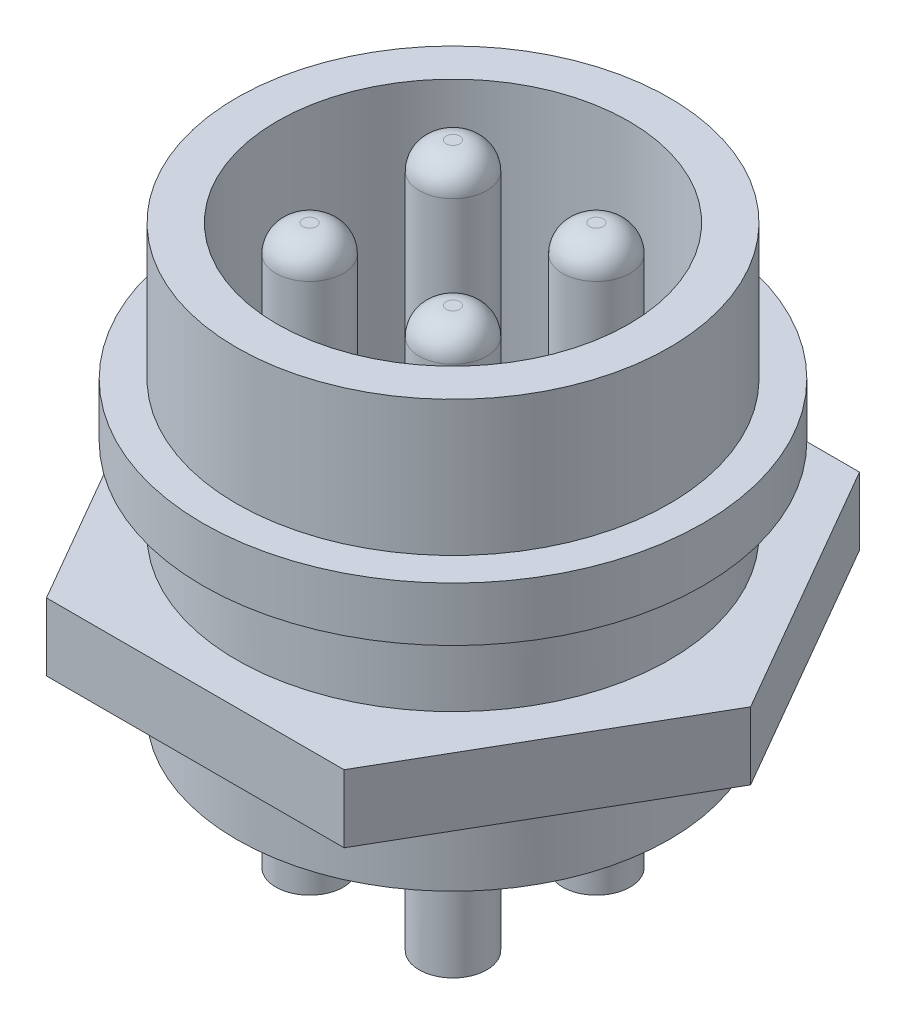
ISO-10303-21;
HEADER;
FILE_DESCRIPTION(('STEP AP214'),'2;1');
FILE_NAME('part.step','',(''),(''),'','','');
FILE_SCHEMA(('AUTOMOTIVE_DESIGN { 1 0 10303 214 1 1 1 1 }'));
ENDSEC;
DATA;
#1=APPLICATION_CONTEXT('core data for automotive mechanical design processes');
#2=APPLICATION_PROTOCOL_DEFINITION('international standard','automotive_design',2000,#1);
#3=PRODUCT_CONTEXT('',#1,'mechanical');
#4=PRODUCT('Part','Part','',(#3));
#5=PRODUCT_RELATED_PRODUCT_CATEGORY('part','',(#4));
#6=PRODUCT_DEFINITION_FORMATION('','',#4);
#7=PRODUCT_DEFINITION_CONTEXT('part definition',#1,'design');
#8=PRODUCT_DEFINITION('design','',#6,#7);
#9=PRODUCT_DEFINITION_SHAPE('','',#8);
#10=(LENGTH_UNIT() NAMED_UNIT(*) SI_UNIT(.MILLI.,.METRE.));
#11=(NAMED_UNIT(*) PLANE_ANGLE_UNIT() SI_UNIT($,.RADIAN.));
#12=(NAMED_UNIT(*) SI_UNIT($,.STERADIAN.) SOLID_ANGLE_UNIT());
#13=UNCERTAINTY_MEASURE_WITH_UNIT(LENGTH_MEASURE(1.E-05),#10,'distance_accuracy_value','');
#14=(GEOMETRIC_REPRESENTATION_CONTEXT(3) GLOBAL_UNCERTAINTY_ASSIGNED_CONTEXT((#13)) GLOBAL_UNIT_ASSIGNED_CONTEXT((#10,
#11,#12)) REPRESENTATION_CONTEXT('',''));
#15=CARTESIAN_POINT('',(0.,0.,0.));
#16=DIRECTION('',(0.,0.,1.));
#17=DIRECTION('',(1.,0.,0.));
#18=AXIS2_PLACEMENT_3D('',#15,#16,#17);
#19=CARTESIAN_POINT('',(-6.19993053920692,15.75,-2.67724273283933));
#20=DIRECTION('',(0.,-1.,0.));
#21=DIRECTION('',(0.,0.,-1.));
#22=AXIS2_PLACEMENT_3D('',#19,#20,#21);
#23=CYLINDRICAL_SURFACE('',#22,8.00000000000001);
#24=CARTESIAN_POINT('',(-6.19993053920692,8.75,-2.67724273283933));
#25=DIRECTION('',(0.,1.,0.));
#26=DIRECTION('',(0.,0.,1.));
#27=AXIS2_PLACEMENT_3D('',#24,#25,#26);
#28=CIRCLE('',#27,8.00000000000001);
#29=CARTESIAN_POINT('',(-6.19993053920692,8.75,5.32275726716068));
#30=VERTEX_POINT('',#29);
#31=EDGE_CURVE('E172',#30,#30,#28,.T.);
#32=ORIENTED_EDGE('',*,*,#31,.F.);
#33=EDGE_LOOP('',(#32));
#34=FACE_BOUND('',#33,.T.);
#35=CARTESIAN_POINT('',(-6.19993053920692,5.75,-2.67724273283933));
#36=DIRECTION('',(0.,-1.,0.));
#37=DIRECTION('',(0.,0.,-1.));
#38=AXIS2_PLACEMENT_3D('',#35,#36,#37);
#39=CIRCLE('',#38,8.00000000000001);
#40=CARTESIAN_POINT('',(-6.19993053920692,5.75,-10.6772427328393));
#41=VERTEX_POINT('',#40);
#42=EDGE_CURVE('E11',#41,#41,#39,.T.);
#43=ORIENTED_EDGE('',*,*,#42,.F.);
#44=EDGE_LOOP('',(#43));
#45=FACE_BOUND('',#44,.T.);
#46=ADVANCED_FACE('F36',(#34,#45),#23,.T.);
#47=CARTESIAN_POINT('',(-6.19993053920692,10.75,-2.67724273283933));
#48=DIRECTION('',(0.,1.,0.));
#49=DIRECTION('',(0.,0.,1.));
#50=AXIS2_PLACEMENT_3D('',#47,#48,#49);
#51=CIRCLE('',#50,8.00000000000001);
#52=CARTESIAN_POINT('',(-6.19993053920692,10.75,5.32275726716068));
#53=VERTEX_POINT('',#52);
#54=EDGE_CURVE('E173',#53,#53,#51,.T.);
#55=ORIENTED_EDGE('',*,*,#54,.T.);
#56=EDGE_LOOP('',(#55));
#57=FACE_BOUND('',#56,.T.);
#58=CARTESIAN_POINT('',(-6.19993053920692,15.75,-2.67724273283933));
#59=DIRECTION('',(0.,1.,0.));
#60=DIRECTION('',(0.,0.,1.));
#61=AXIS2_PLACEMENT_3D('',#58,#59,#60);
#62=CIRCLE('',#61,8.00000000000001);
#63=CARTESIAN_POINT('',(-6.19993053920692,15.75,5.32275726716068));
#64=VERTEX_POINT('',#63);
#65=EDGE_CURVE('E189',#64,#64,#62,.T.);
#66=ORIENTED_EDGE('',*,*,#65,.F.);
#67=EDGE_LOOP('',(#66));
#68=FACE_BOUND('',#67,.T.);
#69=ADVANCED_FACE('F262',(#57,#68),#23,.T.);
#70=CARTESIAN_POINT('',(-6.19993053920692,15.75,-2.67724273283933));
#71=DIRECTION('',(0.,1.,0.));
#72=DIRECTION('',(0.,0.,1.));
#73=AXIS2_PLACEMENT_3D('',#70,#71,#72);
#74=PLANE('',#73);
#75=CARTESIAN_POINT('',(-6.19993053920692,15.75,-2.67724273283933));
#76=DIRECTION('',(0.,1.,0.));
#77=DIRECTION('',(0.,0.,1.));
#78=AXIS2_PLACEMENT_3D('',#75,#76,#77);
#79=CIRCLE('',#78,6.5);
#80=CARTESIAN_POINT('',(-6.19993053920692,15.75,3.82275726716067));
#81=VERTEX_POINT('',#80);
#82=EDGE_CURVE('E180',#81,#81,#79,.T.);
#83=ORIENTED_EDGE('',*,*,#82,.F.);
#84=EDGE_LOOP('',(#83));
#85=FACE_BOUND('',#84,.T.);
#86=ORIENTED_EDGE('',*,*,#65,.T.);
#87=EDGE_LOOP('',(#86));
#88=FACE_BOUND('',#87,.T.);
#89=ADVANCED_FACE('F256',(#85,#88),#74,.T.);
#90=CARTESIAN_POINT('',(-6.19993053920692,5.75,-2.67724273283933));
#91=DIRECTION('',(0.,1.,0.));
#92=DIRECTION('',(0.,0.,1.));
#93=AXIS2_PLACEMENT_3D('',#90,#91,#92);
#94=CYLINDRICAL_SURFACE('',#93,6.5);
#95=CARTESIAN_POINT('',(-6.19993053920692,5.75,-2.67724273283933));
#96=DIRECTION('',(0.,1.,0.));
#97=DIRECTION('',(0.,0.,1.));
#98=AXIS2_PLACEMENT_3D('',#95,#96,#97);
#99=CIRCLE('',#98,6.5);
#100=CARTESIAN_POINT('',(-6.19993053920692,5.75,3.82275726716067));
#101=VERTEX_POINT('',#100);
#102=EDGE_CURVE('E183',#101,#101,#99,.T.);
#103=ORIENTED_EDGE('',*,*,#102,.F.);
#104=EDGE_LOOP('',(#103));
#105=FACE_BOUND('',#104,.T.);
#106=ORIENTED_EDGE('',*,*,#82,.T.);
#107=EDGE_LOOP('',(#106));
#108=FACE_BOUND('',#107,.T.);
#109=ADVANCED_FACE('F245',(#105,#108),#94,.F.);
#110=CARTESIAN_POINT('',(-6.19993053920692,5.75,-2.67724273283933));
#111=DIRECTION('',(0.,1.,0.));
#112=DIRECTION('',(0.,0.,1.));
#113=AXIS2_PLACEMENT_3D('',#110,#111,#112);
#114=PLANE('',#113);
#115=CARTESIAN_POINT('',(-8.84993053920686,5.75,-5.32724273283933));
#116=DIRECTION('',(0.,1.,0.));
#117=DIRECTION('',(0.,0.,1.));
#118=AXIS2_PLACEMENT_3D('',#115,#116,#117);
#119=CIRCLE('',#118,1.25);
#120=CARTESIAN_POINT('',(-8.84993053920686,5.75,-4.07724273283933));
#121=VERTEX_POINT('',#120);
#122=EDGE_CURVE('E147',#121,#121,#119,.T.);
#123=ORIENTED_EDGE('',*,*,#122,.F.);
#124=EDGE_LOOP('',(#123));
#125=FACE_BOUND('',#124,.T.);
#126=CARTESIAN_POINT('',(-3.54993053920686,5.75,-5.32724273283933));
#127=DIRECTION('',(0.,1.,0.));
#128=DIRECTION('',(0.,0.,1.));
#129=AXIS2_PLACEMENT_3D('',#126,#127,#128);
#130=CIRCLE('',#129,1.25);
#131=CARTESIAN_POINT('',(-3.54993053920686,5.75,-4.07724273283933));
#132=VERTEX_POINT('',#131);
#133=EDGE_CURVE('E151',#132,#132,#130,.T.);
#134=ORIENTED_EDGE('',*,*,#133,.F.);
#135=EDGE_LOOP('',(#134));
#136=FACE_BOUND('',#135,.T.);
#137=CARTESIAN_POINT('',(-3.54993053920692,5.75,-0.02724273283933));
#138=DIRECTION('',(0.,1.,0.));
#139=DIRECTION('',(0.,0.,1.));
#140=AXIS2_PLACEMENT_3D('',#137,#138,#139);
#141=CIRCLE('',#140,1.25);
#142=CARTESIAN_POINT('',(-3.54993053920692,5.75,1.22275726716067));
#143=VERTEX_POINT('',#142);
#144=EDGE_CURVE('E158',#143,#143,#141,.T.);
#145=ORIENTED_EDGE('',*,*,#144,.F.);
#146=EDGE_LOOP('',(#145));
#147=FACE_BOUND('',#146,.T.);
#148=CARTESIAN_POINT('',(-8.84993053920692,5.75,-0.02724273283933));
#149=DIRECTION('',(0.,1.,0.));
#150=DIRECTION('',(0.,0.,1.));
#151=AXIS2_PLACEMENT_3D('',#148,#149,#150);
#152=CIRCLE('',#151,1.25);
#153=CARTESIAN_POINT('',(-8.84993053920692,5.75,1.22275726716067));
#154=VERTEX_POINT('',#153);
#155=EDGE_CURVE('E165',#154,#154,#152,.T.);
#156=ORIENTED_EDGE('',*,*,#155,.F.);
#157=EDGE_LOOP('',(#156));
#158=FACE_BOUND('',#157,.T.);
#159=ORIENTED_EDGE('',*,*,#102,.T.);
#160=EDGE_LOOP('',(#159));
#161=FACE_BOUND('',#160,.T.);
#162=ADVANCED_FACE('F241',(#125,#136,#147,#158,#161),#114,.T.);
#163=CARTESIAN_POINT('',(-6.19993053920692,8.75,-2.67724273283933));
#164=DIRECTION('',(0.,1.,0.));
#165=DIRECTION('',(0.,0.,1.));
#166=AXIS2_PLACEMENT_3D('',#163,#164,#165);
#167=CYLINDRICAL_SURFACE('',#166,9.25);
#168=CARTESIAN_POINT('',(-6.19993053920692,8.75,-2.67724273283933));
#169=DIRECTION('',(0.,1.,0.));
#170=DIRECTION('',(0.,0.,1.));
#171=AXIS2_PLACEMENT_3D('',#168,#169,#170);
#172=CIRCLE('',#171,9.25);
#173=CARTESIAN_POINT('',(-6.19993053920692,8.75,6.57275726716067));
#174=VERTEX_POINT('',#173);
#175=EDGE_CURVE('E177',#174,#174,#172,.T.);
#176=ORIENTED_EDGE('',*,*,#175,.T.);
#177=EDGE_LOOP('',(#176));
#178=FACE_BOUND('',#177,.T.);
#179=CARTESIAN_POINT('',(-6.19993053920692,10.75,-2.67724273283933));
#180=DIRECTION('',(0.,1.,0.));
#181=DIRECTION('',(0.,0.,1.));
#182=AXIS2_PLACEMENT_3D('',#179,#180,#181);
#183=CIRCLE('',#182,9.25);
#184=CARTESIAN_POINT('',(-6.19993053920692,10.75,6.57275726716067));
#185=VERTEX_POINT('',#184);
#186=EDGE_CURVE('E176',#185,#185,#183,.T.);
#187=ORIENTED_EDGE('',*,*,#186,.F.);
#188=EDGE_LOOP('',(#187));
#189=FACE_BOUND('',#188,.T.);
#190=ADVANCED_FACE('F244',(#178,#189),#167,.T.);
#191=CARTESIAN_POINT('',(-6.19993053920692,8.75,-2.67724273283933));
#192=DIRECTION('',(0.,1.,0.));
#193=DIRECTION('',(0.,0.,1.));
#194=AXIS2_PLACEMENT_3D('',#191,#192,#193);
#195=PLANE('',#194);
#196=ORIENTED_EDGE('',*,*,#31,.T.);
#197=EDGE_LOOP('',(#196));
#198=FACE_BOUND('',#197,.T.);
#199=ORIENTED_EDGE('',*,*,#175,.F.);
#200=EDGE_LOOP('',(#199));
#201=FACE_BOUND('',#200,.T.);
#202=ADVANCED_FACE('F367',(#198,#201),#195,.F.);
#203=CARTESIAN_POINT('',(-6.19993053920692,10.75,-2.67724273283933));
#204=DIRECTION('',(0.,1.,0.));
#205=DIRECTION('',(0.,0.,1.));
#206=AXIS2_PLACEMENT_3D('',#203,#204,#205);
#207=PLANE('',#206);
#208=ORIENTED_EDGE('',*,*,#54,.F.);
#209=EDGE_LOOP('',(#208));
#210=FACE_BOUND('',#209,.T.);
#211=ORIENTED_EDGE('',*,*,#186,.T.);
#212=EDGE_LOOP('',(#211));
#213=FACE_BOUND('',#212,.T.);
#214=ADVANCED_FACE('F365',(#210,#213),#207,.T.);
#215=CARTESIAN_POINT('',(-6.19993053920692,15.75,-2.67724273283933));
#216=DIRECTION('',(0.,1.,0.));
#217=DIRECTION('',(0.,0.,1.));
#218=AXIS2_PLACEMENT_3D('',#215,#216,#217);
#219=PLANE('',#218);
#220=CARTESIAN_POINT('',(-8.84993053920692,15.75,-0.02724273283933));
#221=DIRECTION('',(0.,1.,0.));
#222=DIRECTION('',(0.,0.,1.));
#223=AXIS2_PLACEMENT_3D('',#220,#221,#222);
#224=CIRCLE('',#223,0.25);
#225=CARTESIAN_POINT('',(-8.84993053920692,15.75,0.22275726716067));
#226=VERTEX_POINT('',#225);
#227=EDGE_CURVE('E206',#226,#226,#224,.T.);
#228=ORIENTED_EDGE('',*,*,#227,.T.);
#229=EDGE_LOOP('',(#228));
#230=FACE_BOUND('',#229,.T.);
#231=ADVANCED_FACE('F361',(#230),#219,.T.);
#232=CARTESIAN_POINT('',(-8.84993053920692,19.2855339059327,-0.02724273283933));
#233=DIRECTION('',(0.,-1.,0.));
#234=DIRECTION('',(0.,0.,-1.));
#235=AXIS2_PLACEMENT_3D('',#232,#233,#234);
#236=CYLINDRICAL_SURFACE('',#235,1.25);
#237=CARTESIAN_POINT('',(-8.84993053920692,14.75,-0.02724273283933));
#238=DIRECTION('',(0.,1.,0.));
#239=DIRECTION('',(0.,0.,1.));
#240=AXIS2_PLACEMENT_3D('',#237,#238,#239);
#241=CIRCLE('',#240,1.25);
#242=CARTESIAN_POINT('',(-8.84993053920692,14.75,1.22275726716067));
#243=VERTEX_POINT('',#242);
#244=EDGE_CURVE('E150',#243,#243,#241,.F.);
#245=ORIENTED_EDGE('',*,*,#244,.T.);
#246=EDGE_LOOP('',(#245));
#247=FACE_BOUND('',#246,.T.);
#248=ORIENTED_EDGE('',*,*,#155,.T.);
#249=EDGE_LOOP('',(#248));
#250=FACE_BOUND('',#249,.T.);
#251=ADVANCED_FACE('F356',(#247,#250),#236,.T.);
#252=CARTESIAN_POINT('',(-6.19993053920692,15.75,-2.67724273283933));
#253=DIRECTION('',(0.,1.,0.));
#254=DIRECTION('',(0.,0.,1.));
#255=AXIS2_PLACEMENT_3D('',#252,#253,#254);
#256=PLANE('',#255);
#257=CARTESIAN_POINT('',(-3.54993053920692,15.75,-0.02724273283933));
#258=DIRECTION('',(0.,1.,0.));
#259=DIRECTION('',(0.,0.,1.));
#260=AXIS2_PLACEMENT_3D('',#257,#258,#259);
#261=CIRCLE('',#260,0.25);
#262=CARTESIAN_POINT('',(-3.54993053920692,15.75,0.22275726716067));
#263=VERTEX_POINT('',#262);
#264=EDGE_CURVE('E218',#263,#263,#261,.T.);
#265=ORIENTED_EDGE('',*,*,#264,.T.);
#266=EDGE_LOOP('',(#265));
#267=FACE_BOUND('',#266,.T.);
#268=ADVANCED_FACE('F352',(#267),#256,.T.);
#269=CARTESIAN_POINT('',(-3.54993053920692,19.2855339059327,-0.02724273283933));
#270=DIRECTION('',(0.,-1.,0.));
#271=DIRECTION('',(0.,0.,-1.));
#272=AXIS2_PLACEMENT_3D('',#269,#270,#271);
#273=CYLINDRICAL_SURFACE('',#272,1.25);
#274=CARTESIAN_POINT('',(-3.54993053920692,14.75,-0.02724273283933));
#275=DIRECTION('',(0.,1.,0.));
#276=DIRECTION('',(0.,0.,1.));
#277=AXIS2_PLACEMENT_3D('',#274,#275,#276);
#278=CIRCLE('',#277,1.25);
#279=CARTESIAN_POINT('',(-3.54993053920692,14.75,1.22275726716067));
#280=VERTEX_POINT('',#279);
#281=EDGE_CURVE('E215',#280,#280,#278,.F.);
#282=ORIENTED_EDGE('',*,*,#281,.T.);
#283=EDGE_LOOP('',(#282));
#284=FACE_BOUND('',#283,.T.);
#285=ORIENTED_EDGE('',*,*,#144,.T.);
#286=EDGE_LOOP('',(#285));
#287=FACE_BOUND('',#286,.T.);
#288=ADVANCED_FACE('F346',(#284,#287),#273,.T.);
#289=CARTESIAN_POINT('',(-6.19993053920692,15.75,-2.67724273283933));
#290=DIRECTION('',(0.,1.,0.));
#291=DIRECTION('',(0.,0.,1.));
#292=AXIS2_PLACEMENT_3D('',#289,#290,#291);
#293=PLANE('',#292);
#294=CARTESIAN_POINT('',(-3.54993053920686,15.75,-5.32724273283933));
#295=DIRECTION('',(0.,1.,0.));
#296=DIRECTION('',(0.,0.,1.));
#297=AXIS2_PLACEMENT_3D('',#294,#295,#296);
#298=CIRCLE('',#297,0.25);
#299=CARTESIAN_POINT('',(-3.54993053920686,15.75,-5.07724273283933));
#300=VERTEX_POINT('',#299);
#301=EDGE_CURVE('E45',#300,#300,#298,.T.);
#302=ORIENTED_EDGE('',*,*,#301,.T.);
#303=EDGE_LOOP('',(#302));
#304=FACE_BOUND('',#303,.T.);
#305=ADVANCED_FACE('F226',(#304),#293,.T.);
#306=CARTESIAN_POINT('',(-3.54993053920686,19.2855339059327,-5.32724273283933));
#307=DIRECTION('',(0.,-1.,0.));
#308=DIRECTION('',(0.,0.,-1.));
#309=AXIS2_PLACEMENT_3D('',#306,#307,#308);
#310=CYLINDRICAL_SURFACE('',#309,1.25);
#311=CARTESIAN_POINT('',(-3.54993053920686,14.75,-5.32724273283933));
#312=DIRECTION('',(0.,1.,0.));
#313=DIRECTION('',(0.,0.,1.));
#314=AXIS2_PLACEMENT_3D('',#311,#312,#313);
#315=CIRCLE('',#314,1.25);
#316=CARTESIAN_POINT('',(-3.54993053920686,14.75,-4.07724273283933));
#317=VERTEX_POINT('',#316);
#318=EDGE_CURVE('E221',#317,#317,#315,.F.);
#319=ORIENTED_EDGE('',*,*,#318,.T.);
#320=EDGE_LOOP('',(#319));
#321=FACE_BOUND('',#320,.T.);
#322=ORIENTED_EDGE('',*,*,#133,.T.);
#323=EDGE_LOOP('',(#322));
#324=FACE_BOUND('',#323,.T.);
#325=ADVANCED_FACE('F233',(#321,#324),#310,.T.);
#326=CARTESIAN_POINT('',(-6.19993053920692,15.75,-2.67724273283933));
#327=DIRECTION('',(0.,1.,0.));
#328=DIRECTION('',(0.,0.,1.));
#329=AXIS2_PLACEMENT_3D('',#326,#327,#328);
#330=PLANE('',#329);
#331=CARTESIAN_POINT('',(-8.84993053920686,15.75,-5.32724273283933));
#332=DIRECTION('',(0.,1.,0.));
#333=DIRECTION('',(0.,0.,1.));
#334=AXIS2_PLACEMENT_3D('',#331,#332,#333);
#335=CIRCLE('',#334,0.25);
#336=CARTESIAN_POINT('',(-8.84993053920686,15.75,-5.07724273283933));
#337=VERTEX_POINT('',#336);
#338=EDGE_CURVE('E212',#337,#337,#335,.T.);
#339=ORIENTED_EDGE('',*,*,#338,.T.);
#340=EDGE_LOOP('',(#339));
#341=FACE_BOUND('',#340,.T.);
#342=ADVANCED_FACE('F236',(#341),#330,.T.);
#343=CARTESIAN_POINT('',(-8.84993053920686,19.2855339059327,-5.32724273283933));
#344=DIRECTION('',(0.,-1.,0.));
#345=DIRECTION('',(0.,0.,-1.));
#346=AXIS2_PLACEMENT_3D('',#343,#344,#345);
#347=CYLINDRICAL_SURFACE('',#346,1.25);
#348=CARTESIAN_POINT('',(-8.84993053920686,14.75,-5.32724273283933));
#349=DIRECTION('',(0.,1.,0.));
#350=DIRECTION('',(0.,0.,1.));
#351=AXIS2_PLACEMENT_3D('',#348,#349,#350);
#352=CIRCLE('',#351,1.25);
#353=CARTESIAN_POINT('',(-8.84993053920686,14.75,-4.07724273283933));
#354=VERTEX_POINT('',#353);
#355=EDGE_CURVE('E209',#354,#354,#352,.F.);
#356=ORIENTED_EDGE('',*,*,#355,.T.);
#357=EDGE_LOOP('',(#356));
#358=FACE_BOUND('',#357,.T.);
#359=ORIENTED_EDGE('',*,*,#122,.T.);
#360=EDGE_LOOP('',(#359));
#361=FACE_BOUND('',#360,.T.);
#362=ADVANCED_FACE('F333',(#358,#361),#347,.T.);
#363=CARTESIAN_POINT('',(-8.84993053920692,14.75,-0.02724273283933));
#364=DIRECTION('',(0.,1.,0.));
#365=DIRECTION('',(0.,0.,1.));
#366=AXIS2_PLACEMENT_3D('',#363,#364,#365);
#367=DEGENERATE_TOROIDAL_SURFACE('',#366,0.25,1.,.T.);
#368=ORIENTED_EDGE('',*,*,#227,.F.);
#369=EDGE_LOOP('',(#368));
#370=FACE_BOUND('',#369,.T.);
#371=ORIENTED_EDGE('',*,*,#244,.F.);
#372=EDGE_LOOP('',(#371));
#373=FACE_BOUND('',#372,.T.);
#374=ADVANCED_FACE('F336',(#370,#373),#367,.T.);
#375=CARTESIAN_POINT('',(-8.84993053920686,14.75,-5.32724273283933));
#376=DIRECTION('',(0.,1.,0.));
#377=DIRECTION('',(0.,0.,1.));
#378=AXIS2_PLACEMENT_3D('',#375,#376,#377);
#379=DEGENERATE_TOROIDAL_SURFACE('',#378,0.25,1.,.T.);
#380=ORIENTED_EDGE('',*,*,#338,.F.);
#381=EDGE_LOOP('',(#380));
#382=FACE_BOUND('',#381,.T.);
#383=ORIENTED_EDGE('',*,*,#355,.F.);
#384=EDGE_LOOP('',(#383));
#385=FACE_BOUND('',#384,.T.);
#386=ADVANCED_FACE('F433',(#382,#385),#379,.T.);
#387=CARTESIAN_POINT('',(-3.54993053920692,14.75,-0.02724273283933));
#388=DIRECTION('',(0.,1.,0.));
#389=DIRECTION('',(0.,0.,1.));
#390=AXIS2_PLACEMENT_3D('',#387,#388,#389);
#391=DEGENERATE_TOROIDAL_SURFACE('',#390,0.25,1.,.T.);
#392=ORIENTED_EDGE('',*,*,#264,.F.);
#393=EDGE_LOOP('',(#392));
#394=FACE_BOUND('',#393,.T.);
#395=ORIENTED_EDGE('',*,*,#281,.F.);
#396=EDGE_LOOP('',(#395));
#397=FACE_BOUND('',#396,.T.);
#398=ADVANCED_FACE('F230',(#394,#397),#391,.T.);
#399=CARTESIAN_POINT('',(-3.54993053920686,14.75,-5.32724273283933));
#400=DIRECTION('',(0.,1.,0.));
#401=DIRECTION('',(0.,0.,1.));
#402=AXIS2_PLACEMENT_3D('',#399,#400,#401);
#403=DEGENERATE_TOROIDAL_SURFACE('',#402,0.25,1.,.T.);
#404=ORIENTED_EDGE('',*,*,#301,.F.);
#405=EDGE_LOOP('',(#404));
#406=FACE_BOUND('',#405,.T.);
#407=ORIENTED_EDGE('',*,*,#318,.F.);
#408=EDGE_LOOP('',(#407));
#409=FACE_BOUND('',#408,.T.);
#410=ADVANCED_FACE('F38',(#406,#409),#403,.T.);
#411=CARTESIAN_POINT('',(0.,3.25,0.));
#412=DIRECTION('',(0.,-1.,0.));
#413=DIRECTION('',(0.,0.,-1.));
#414=AXIS2_PLACEMENT_3D('',#411,#412,#413);
#415=PLANE('',#414);
#416=DIRECTION('',(-0.499999999999995,0.,-0.866025403784441));
#417=VECTOR('',#416,1.);
#418=CARTESIAN_POINT('',(-11.7011094261291,3.25,6.85107860083475));
#419=LINE('',#418,#417);
#420=CARTESIAN_POINT('',(-11.7011094261291,3.25,6.85107860083475));
#421=VERTEX_POINT('',#420);
#422=CARTESIAN_POINT('',(-17.202288313051,3.25,-2.67724273283933));
#423=VERTEX_POINT('',#422);
#424=EDGE_CURVE('E134',#421,#423,#419,.T.);
#425=ORIENTED_EDGE('',*,*,#424,.T.);
#426=DIRECTION('',(0.500000000000001,0.,-0.866025403784438));
#427=VECTOR('',#426,1.);
#428=CARTESIAN_POINT('',(-17.202288313051,3.25,-2.67724273283933));
#429=LINE('',#428,#427);
#430=CARTESIAN_POINT('',(-11.7011094261289,3.25,-12.2055640665135));
#431=VERTEX_POINT('',#430);
#432=EDGE_CURVE('E91',#423,#431,#429,.T.);
#433=ORIENTED_EDGE('',*,*,#432,.T.);
#434=DIRECTION('',(1.,0.,0.));
#435=VECTOR('',#434,1.);
#436=CARTESIAN_POINT('',(-11.7011094261289,3.25,-12.2055640665135));
#437=LINE('',#436,#435);
#438=CARTESIAN_POINT('',(-0.698751652284856,3.25,-12.2055640665134));
#439=VERTEX_POINT('',#438);
#440=EDGE_CURVE('E105',#431,#439,#437,.T.);
#441=ORIENTED_EDGE('',*,*,#440,.T.);
#442=DIRECTION('',(0.499999999999995,0.,0.866025403784441));
#443=VECTOR('',#442,1.);
#444=CARTESIAN_POINT('',(-0.698751652284856,3.25,-12.2055640665134));
#445=LINE('',#444,#443);
#446=CARTESIAN_POINT('',(4.80242723463712,3.25,-2.67724273283925));
#447=VERTEX_POINT('',#446);
#448=EDGE_CURVE('E98',#439,#447,#445,.T.);
#449=ORIENTED_EDGE('',*,*,#448,.T.);
#450=DIRECTION('',(-0.500000000000007,0.,0.866025403784435));
#451=VECTOR('',#450,1.);
#452=CARTESIAN_POINT('',(4.80242723463712,3.25,-2.67724273283925));
#453=LINE('',#452,#451);
#454=CARTESIAN_POINT('',(-0.698751652284989,3.25,6.85107860083487));
#455=VERTEX_POINT('',#454);
#456=EDGE_CURVE('E103',#447,#455,#453,.T.);
#457=ORIENTED_EDGE('',*,*,#456,.T.);
#458=DIRECTION('',(-1.,0.,0.));
#459=VECTOR('',#458,1.);
#460=CARTESIAN_POINT('',(-0.698751652284989,3.25,6.85107860083487));
#461=LINE('',#460,#459);
#462=EDGE_CURVE('E53',#455,#421,#461,.T.);
#463=ORIENTED_EDGE('',*,*,#462,.T.);
#464=EDGE_LOOP('',(#425,#433,#441,#449,#457,#463));
#465=FACE_BOUND('',#464,.T.);
#466=CARTESIAN_POINT('',(-6.19993053920692,3.25,-2.67724273283933));
#467=DIRECTION('',(0.,-1.,0.));
#468=DIRECTION('',(0.,0.,-1.));
#469=AXIS2_PLACEMENT_3D('',#466,#467,#468);
#470=CIRCLE('',#469,8.00000000000001);
#471=CARTESIAN_POINT('',(-6.19993053920692,3.25,-10.6772427328393));
#472=VERTEX_POINT('',#471);
#473=EDGE_CURVE('E127',#472,#472,#470,.T.);
#474=ORIENTED_EDGE('',*,*,#473,.F.);
#475=EDGE_LOOP('',(#474));
#476=FACE_BOUND('',#475,.T.);
#477=ADVANCED_FACE('F100',(#465,#476),#415,.T.);
#478=CARTESIAN_POINT('',(0.,5.75,0.));
#479=DIRECTION('',(0.,-1.,0.));
#480=DIRECTION('',(0.,0.,-1.));
#481=AXIS2_PLACEMENT_3D('',#478,#479,#480);
#482=PLANE('',#481);
#483=DIRECTION('',(-0.499999999999995,0.,-0.866025403784441));
#484=VECTOR('',#483,1.);
#485=CARTESIAN_POINT('',(-11.7011094261291,5.75,6.85107860083475));
#486=LINE('',#485,#484);
#487=CARTESIAN_POINT('',(-11.7011094261291,5.75,6.85107860083475));
#488=VERTEX_POINT('',#487);
#489=CARTESIAN_POINT('',(-17.202288313051,5.75,-2.67724273283933));
#490=VERTEX_POINT('',#489);
#491=EDGE_CURVE('E123',#488,#490,#486,.T.);
#492=ORIENTED_EDGE('',*,*,#491,.F.);
#493=DIRECTION('',(-1.,0.,0.));
#494=VECTOR('',#493,1.);
#495=CARTESIAN_POINT('',(-0.698751652284989,5.75,6.85107860083487));
#496=LINE('',#495,#494);
#497=CARTESIAN_POINT('',(-0.698751652284989,5.75,6.85107860083487));
#498=VERTEX_POINT('',#497);
#499=EDGE_CURVE('E82',#498,#488,#496,.T.);
#500=ORIENTED_EDGE('',*,*,#499,.F.);
#501=DIRECTION('',(-0.500000000000007,0.,0.866025403784435));
#502=VECTOR('',#501,1.);
#503=CARTESIAN_POINT('',(4.80242723463712,5.75,-2.67724273283925));
#504=LINE('',#503,#502);
#505=CARTESIAN_POINT('',(4.80242723463712,5.75,-2.67724273283925));
#506=VERTEX_POINT('',#505);
#507=EDGE_CURVE('E76',#506,#498,#504,.T.);
#508=ORIENTED_EDGE('',*,*,#507,.F.);
#509=DIRECTION('',(0.499999999999995,0.,0.866025403784441));
#510=VECTOR('',#509,1.);
#511=CARTESIAN_POINT('',(-0.698751652284856,5.75,-12.2055640665134));
#512=LINE('',#511,#510);
#513=CARTESIAN_POINT('',(-0.698751652284856,5.75,-12.2055640665134));
#514=VERTEX_POINT('',#513);
#515=EDGE_CURVE('E113',#514,#506,#512,.T.);
#516=ORIENTED_EDGE('',*,*,#515,.F.);
#517=DIRECTION('',(1.,0.,0.));
#518=VECTOR('',#517,1.);
#519=CARTESIAN_POINT('',(-11.7011094261289,5.75,-12.2055640665135));
#520=LINE('',#519,#518);
#521=CARTESIAN_POINT('',(-11.7011094261289,5.75,-12.2055640665135));
#522=VERTEX_POINT('',#521);
#523=EDGE_CURVE('E129',#522,#514,#520,.T.);
#524=ORIENTED_EDGE('',*,*,#523,.F.);
#525=DIRECTION('',(0.500000000000001,0.,-0.866025403784438));
#526=VECTOR('',#525,1.);
#527=CARTESIAN_POINT('',(-17.202288313051,5.75,-2.67724273283933));
#528=LINE('',#527,#526);
#529=EDGE_CURVE('E126',#490,#522,#528,.T.);
#530=ORIENTED_EDGE('',*,*,#529,.F.);
#531=EDGE_LOOP('',(#492,#500,#508,#516,#524,#530));
#532=FACE_BOUND('',#531,.T.);
#533=ORIENTED_EDGE('',*,*,#42,.T.);
#534=EDGE_LOOP('',(#533));
#535=FACE_BOUND('',#534,.T.);
#536=ADVANCED_FACE('F300',(#532,#535),#482,.F.);
#537=CARTESIAN_POINT('',(-11.7011094261291,3.25,6.85107860083475));
#538=DIRECTION('',(0.866025403784442,0.,-0.499999999999995));
#539=DIRECTION('',(-0.499999999999995,0.,-0.866025403784442));
#540=AXIS2_PLACEMENT_3D('',#537,#538,#539);
#541=PLANE('',#540);
#542=ORIENTED_EDGE('',*,*,#491,.T.);
#543=DIRECTION('',(0.,1.,0.));
#544=VECTOR('',#543,1.);
#545=CARTESIAN_POINT('',(-17.202288313051,3.25,-2.67724273283933));
#546=LINE('',#545,#544);
#547=EDGE_CURVE('E141',#423,#490,#546,.T.);
#548=ORIENTED_EDGE('',*,*,#547,.F.);
#549=ORIENTED_EDGE('',*,*,#424,.F.);
#550=DIRECTION('',(0.,1.,0.));
#551=VECTOR('',#550,1.);
#552=CARTESIAN_POINT('',(-11.7011094261291,3.25,6.85107860083475));
#553=LINE('',#552,#551);
#554=EDGE_CURVE('E119',#421,#488,#553,.T.);
#555=ORIENTED_EDGE('',*,*,#554,.T.);
#556=EDGE_LOOP('',(#542,#548,#549,#555));
#557=FACE_BOUND('',#556,.T.);
#558=ADVANCED_FACE('F303',(#557),#541,.F.);
#559=CARTESIAN_POINT('',(-17.202288313051,3.25,-2.67724273283933));
#560=DIRECTION('',(0.866025403784438,0.,0.500000000000001));
#561=DIRECTION('',(0.500000000000001,0.,-0.866025403784438));
#562=AXIS2_PLACEMENT_3D('',#559,#560,#561);
#563=PLANE('',#562);
#564=ORIENTED_EDGE('',*,*,#529,.T.);
#565=DIRECTION('',(0.,1.,0.));
#566=VECTOR('',#565,1.);
#567=CARTESIAN_POINT('',(-11.7011094261289,3.25,-12.2055640665135));
#568=LINE('',#567,#566);
#569=EDGE_CURVE('E138',#431,#522,#568,.T.);
#570=ORIENTED_EDGE('',*,*,#569,.F.);
#571=ORIENTED_EDGE('',*,*,#432,.F.);
#572=ORIENTED_EDGE('',*,*,#547,.T.);
#573=EDGE_LOOP('',(#564,#570,#571,#572));
#574=FACE_BOUND('',#573,.T.);
#575=ADVANCED_FACE('F294',(#574),#563,.F.);
#576=CARTESIAN_POINT('',(-11.7011094261289,3.25,-12.2055640665135));
#577=DIRECTION('',(0.,0.,1.));
#578=DIRECTION('',(1.,0.,0.));
#579=AXIS2_PLACEMENT_3D('',#576,#577,#578);
#580=PLANE('',#579);
#581=ORIENTED_EDGE('',*,*,#523,.T.);
#582=DIRECTION('',(0.,1.,0.));
#583=VECTOR('',#582,1.);
#584=CARTESIAN_POINT('',(-0.698751652284856,3.25,-12.2055640665134));
#585=LINE('',#584,#583);
#586=EDGE_CURVE('E114',#439,#514,#585,.T.);
#587=ORIENTED_EDGE('',*,*,#586,.F.);
#588=ORIENTED_EDGE('',*,*,#440,.F.);
#589=ORIENTED_EDGE('',*,*,#569,.T.);
#590=EDGE_LOOP('',(#581,#587,#588,#589));
#591=FACE_BOUND('',#590,.T.);
#592=ADVANCED_FACE('F297',(#591),#580,.F.);
#593=CARTESIAN_POINT('',(-0.698751652284856,3.25,-12.2055640665134));
#594=DIRECTION('',(-0.866025403784442,0.,0.499999999999995));
#595=DIRECTION('',(0.499999999999995,0.,0.866025403784442));
#596=AXIS2_PLACEMENT_3D('',#593,#594,#595);
#597=PLANE('',#596);
#598=ORIENTED_EDGE('',*,*,#515,.T.);
#599=DIRECTION('',(0.,1.,0.));
#600=VECTOR('',#599,1.);
#601=CARTESIAN_POINT('',(4.80242723463712,3.25,-2.67724273283925));
#602=LINE('',#601,#600);
#603=EDGE_CURVE('E110',#447,#506,#602,.T.);
#604=ORIENTED_EDGE('',*,*,#603,.F.);
#605=ORIENTED_EDGE('',*,*,#448,.F.);
#606=ORIENTED_EDGE('',*,*,#586,.T.);
#607=EDGE_LOOP('',(#598,#604,#605,#606));
#608=FACE_BOUND('',#607,.T.);
#609=ADVANCED_FACE('F111',(#608),#597,.F.);
#610=CARTESIAN_POINT('',(4.80242723463712,3.25,-2.67724273283925));
#611=DIRECTION('',(-0.866025403784435,0.,-0.500000000000007));
#612=DIRECTION('',(-0.500000000000007,0.,0.866025403784435));
#613=AXIS2_PLACEMENT_3D('',#610,#611,#612);
#614=PLANE('',#613);
#615=ORIENTED_EDGE('',*,*,#507,.T.);
#616=DIRECTION('',(0.,1.,0.));
#617=VECTOR('',#616,1.);
#618=CARTESIAN_POINT('',(-0.698751652284989,3.25,6.85107860083487));
#619=LINE('',#618,#617);
#620=EDGE_CURVE('E115',#455,#498,#619,.T.);
#621=ORIENTED_EDGE('',*,*,#620,.F.);
#622=ORIENTED_EDGE('',*,*,#456,.F.);
#623=ORIENTED_EDGE('',*,*,#603,.T.);
#624=EDGE_LOOP('',(#615,#621,#622,#623));
#625=FACE_BOUND('',#624,.T.);
#626=ADVANCED_FACE('F117',(#625),#614,.F.);
#627=CARTESIAN_POINT('',(-0.698751652284989,3.25,6.85107860083487));
#628=DIRECTION('',(0.,0.,-1.));
#629=DIRECTION('',(-1.,0.,0.));
#630=AXIS2_PLACEMENT_3D('',#627,#628,#629);
#631=PLANE('',#630);
#632=ORIENTED_EDGE('',*,*,#499,.T.);
#633=ORIENTED_EDGE('',*,*,#554,.F.);
#634=ORIENTED_EDGE('',*,*,#462,.F.);
#635=ORIENTED_EDGE('',*,*,#620,.T.);
#636=EDGE_LOOP('',(#632,#633,#634,#635));
#637=FACE_BOUND('',#636,.T.);
#638=ADVANCED_FACE('F304',(#637),#631,.F.);
#639=CARTESIAN_POINT('',(-8.84993053920692,-4.9,-0.02724273283933));
#640=DIRECTION('',(0.,-1.,0.));
#641=DIRECTION('',(0.,0.,-1.));
#642=AXIS2_PLACEMENT_3D('',#639,#640,#641);
#643=PLANE('',#642);
#644=CARTESIAN_POINT('',(-8.84993053920692,-4.9,-0.02724273283933));
#645=DIRECTION('',(0.,-1.,0.));
#646=DIRECTION('',(0.,0.,-1.));
#647=AXIS2_PLACEMENT_3D('',#644,#645,#646);
#648=CIRCLE('',#647,1.25);
#649=CARTESIAN_POINT('',(-8.84993053920692,-4.9,-1.27724273283933));
#650=VERTEX_POINT('',#649);
#651=EDGE_CURVE('E166',#650,#650,#648,.T.);
#652=ORIENTED_EDGE('',*,*,#651,.T.);
#653=EDGE_LOOP('',(#652));
#654=FACE_BOUND('',#653,.T.);
#655=ADVANCED_FACE('F306',(#654),#643,.T.);
#656=CARTESIAN_POINT('',(-3.54993053920692,-4.9,-0.02724273283933));
#657=DIRECTION('',(0.,-1.,0.));
#658=DIRECTION('',(0.,0.,-1.));
#659=AXIS2_PLACEMENT_3D('',#656,#657,#658);
#660=PLANE('',#659);
#661=CARTESIAN_POINT('',(-3.54993053920692,-4.9,-0.02724273283933));
#662=DIRECTION('',(0.,-1.,0.));
#663=DIRECTION('',(0.,0.,-1.));
#664=AXIS2_PLACEMENT_3D('',#661,#662,#663);
#665=CIRCLE('',#664,1.25);
#666=CARTESIAN_POINT('',(-3.54993053920692,-4.9,-1.27724273283933));
#667=VERTEX_POINT('',#666);
#668=EDGE_CURVE('E159',#667,#667,#665,.T.);
#669=ORIENTED_EDGE('',*,*,#668,.T.);
#670=EDGE_LOOP('',(#669));
#671=FACE_BOUND('',#670,.T.);
#672=ADVANCED_FACE('F312',(#671),#660,.T.);
#673=CARTESIAN_POINT('',(-3.54993053920686,-4.9,-5.32724273283933));
#674=DIRECTION('',(0.,-1.,0.));
#675=DIRECTION('',(0.,0.,-1.));
#676=AXIS2_PLACEMENT_3D('',#673,#674,#675);
#677=PLANE('',#676);
#678=CARTESIAN_POINT('',(-3.54993053920686,-4.9,-5.32724273283933));
#679=DIRECTION('',(0.,-1.,0.));
#680=DIRECTION('',(0.,0.,-1.));
#681=AXIS2_PLACEMENT_3D('',#678,#679,#680);
#682=CIRCLE('',#681,1.25);
#683=CARTESIAN_POINT('',(-3.54993053920686,-4.9,-6.57724273283933));
#684=VERTEX_POINT('',#683);
#685=EDGE_CURVE('E152',#684,#684,#682,.T.);
#686=ORIENTED_EDGE('',*,*,#685,.T.);
#687=EDGE_LOOP('',(#686));
#688=FACE_BOUND('',#687,.T.);
#689=ADVANCED_FACE('F331',(#688),#677,.T.);
#690=CARTESIAN_POINT('',(-8.84993053920686,-4.9,-5.32724273283933));
#691=DIRECTION('',(0.,-1.,0.));
#692=DIRECTION('',(0.,0.,-1.));
#693=AXIS2_PLACEMENT_3D('',#690,#691,#692);
#694=PLANE('',#693);
#695=CARTESIAN_POINT('',(-8.84993053920686,-4.9,-5.32724273283933));
#696=DIRECTION('',(0.,-1.,0.));
#697=DIRECTION('',(0.,0.,-1.));
#698=AXIS2_PLACEMENT_3D('',#695,#696,#697);
#699=CIRCLE('',#698,1.25);
#700=CARTESIAN_POINT('',(-8.84993053920686,-4.9,-6.57724273283933));
#701=VERTEX_POINT('',#700);
#702=EDGE_CURVE('E143',#701,#701,#699,.T.);
#703=ORIENTED_EDGE('',*,*,#702,.T.);
#704=EDGE_LOOP('',(#703));
#705=FACE_BOUND('',#704,.T.);
#706=ADVANCED_FACE('F327',(#705),#694,.T.);
#707=ORIENTED_EDGE('',*,*,#651,.F.);
#708=EDGE_LOOP('',(#707));
#709=FACE_BOUND('',#708,.T.);
#710=CARTESIAN_POINT('',(-8.84993053920692,0.,-0.02724273283933));
#711=DIRECTION('',(0.,1.,0.));
#712=DIRECTION('',(0.,0.,1.));
#713=AXIS2_PLACEMENT_3D('',#710,#711,#712);
#714=CIRCLE('',#713,1.25);
#715=CARTESIAN_POINT('',(-8.84993053920692,0.,1.22275726716067));
#716=VERTEX_POINT('',#715);
#717=EDGE_CURVE('E169',#716,#716,#714,.T.);
#718=ORIENTED_EDGE('',*,*,#717,.F.);
#719=EDGE_LOOP('',(#718));
#720=FACE_BOUND('',#719,.T.);
#721=ADVANCED_FACE('F330',(#709,#720),#236,.T.);
#722=ORIENTED_EDGE('',*,*,#668,.F.);
#723=EDGE_LOOP('',(#722));
#724=FACE_BOUND('',#723,.T.);
#725=CARTESIAN_POINT('',(-3.54993053920692,0.,-0.02724273283933));
#726=DIRECTION('',(0.,1.,0.));
#727=DIRECTION('',(0.,0.,1.));
#728=AXIS2_PLACEMENT_3D('',#725,#726,#727);
#729=CIRCLE('',#728,1.25);
#730=CARTESIAN_POINT('',(-3.54993053920692,0.,1.22275726716067));
#731=VERTEX_POINT('',#730);
#732=EDGE_CURVE('E162',#731,#731,#729,.T.);
#733=ORIENTED_EDGE('',*,*,#732,.F.);
#734=EDGE_LOOP('',(#733));
#735=FACE_BOUND('',#734,.T.);
#736=ADVANCED_FACE('F354',(#724,#735),#273,.T.);
#737=ORIENTED_EDGE('',*,*,#685,.F.);
#738=EDGE_LOOP('',(#737));
#739=FACE_BOUND('',#738,.T.);
#740=CARTESIAN_POINT('',(-3.54993053920686,0.,-5.32724273283933));
#741=DIRECTION('',(0.,1.,0.));
#742=DIRECTION('',(0.,0.,1.));
#743=AXIS2_PLACEMENT_3D('',#740,#741,#742);
#744=CIRCLE('',#743,1.25);
#745=CARTESIAN_POINT('',(-3.54993053920686,0.,-4.07724273283933));
#746=VERTEX_POINT('',#745);
#747=EDGE_CURVE('E155',#746,#746,#744,.T.);
#748=ORIENTED_EDGE('',*,*,#747,.F.);
#749=EDGE_LOOP('',(#748));
#750=FACE_BOUND('',#749,.T.);
#751=ADVANCED_FACE('F238',(#739,#750),#310,.T.);
#752=ORIENTED_EDGE('',*,*,#702,.F.);
#753=EDGE_LOOP('',(#752));
#754=FACE_BOUND('',#753,.T.);
#755=CARTESIAN_POINT('',(-8.84993053920686,0.,-5.32724273283933));
#756=DIRECTION('',(0.,1.,0.));
#757=DIRECTION('',(0.,0.,1.));
#758=AXIS2_PLACEMENT_3D('',#755,#756,#757);
#759=CIRCLE('',#758,1.25);
#760=CARTESIAN_POINT('',(-8.84993053920686,0.,-4.07724273283933));
#761=VERTEX_POINT('',#760);
#762=EDGE_CURVE('E146',#761,#761,#759,.T.);
#763=ORIENTED_EDGE('',*,*,#762,.F.);
#764=EDGE_LOOP('',(#763));
#765=FACE_BOUND('',#764,.T.);
#766=ADVANCED_FACE('F282',(#754,#765),#347,.T.);
#767=CARTESIAN_POINT('',(-6.19993053920692,0.,-2.67724273283933));
#768=DIRECTION('',(0.,1.,0.));
#769=DIRECTION('',(0.,0.,1.));
#770=AXIS2_PLACEMENT_3D('',#767,#768,#769);
#771=PLANE('',#770);
#772=ORIENTED_EDGE('',*,*,#762,.T.);
#773=EDGE_LOOP('',(#772));
#774=FACE_BOUND('',#773,.T.);
#775=ORIENTED_EDGE('',*,*,#747,.T.);
#776=EDGE_LOOP('',(#775));
#777=FACE_BOUND('',#776,.T.);
#778=ORIENTED_EDGE('',*,*,#732,.T.);
#779=EDGE_LOOP('',(#778));
#780=FACE_BOUND('',#779,.T.);
#781=ORIENTED_EDGE('',*,*,#717,.T.);
#782=EDGE_LOOP('',(#781));
#783=FACE_BOUND('',#782,.T.);
#784=CARTESIAN_POINT('',(-6.19993053920692,0.,-2.67724273283933));
#785=DIRECTION('',(0.,1.,0.));
#786=DIRECTION('',(0.,0.,1.));
#787=AXIS2_PLACEMENT_3D('',#784,#785,#786);
#788=CIRCLE('',#787,8.00000000000001);
#789=CARTESIAN_POINT('',(-6.19993053920692,0.,5.32275726716068));
#790=VERTEX_POINT('',#789);
#791=EDGE_CURVE('E186',#790,#790,#788,.T.);
#792=ORIENTED_EDGE('',*,*,#791,.F.);
#793=EDGE_LOOP('',(#792));
#794=FACE_BOUND('',#793,.T.);
#795=ADVANCED_FACE('F277',(#774,#777,#780,#783,#794),#771,.F.);
#796=ORIENTED_EDGE('',*,*,#473,.T.);
#797=EDGE_LOOP('',(#796));
#798=FACE_BOUND('',#797,.T.);
#799=ORIENTED_EDGE('',*,*,#791,.T.);
#800=EDGE_LOOP('',(#799));
#801=FACE_BOUND('',#800,.T.);
#802=ADVANCED_FACE('F269',(#798,#801),#23,.T.);
#803=CLOSED_SHELL('',(#46,#69,#89,#109,#162,#190,#202,#214,#231,#251,#268,#288,#305,#325,#342,
#362,#374,#386,#398,#410,#477,#536,#558,#575,#592,#609,#626,#638,#655,#672,#689,#706,#721,#736,
#751,#766,#795,#802));
#804=MANIFOLD_SOLID_BREP('B2',#803);
#805=ADVANCED_BREP_SHAPE_REPRESENTATION('',(#18,#804),#14);
#806=SHAPE_DEFINITION_REPRESENTATION(#9,#805);
ENDSEC;
END-ISO-10303-21;
